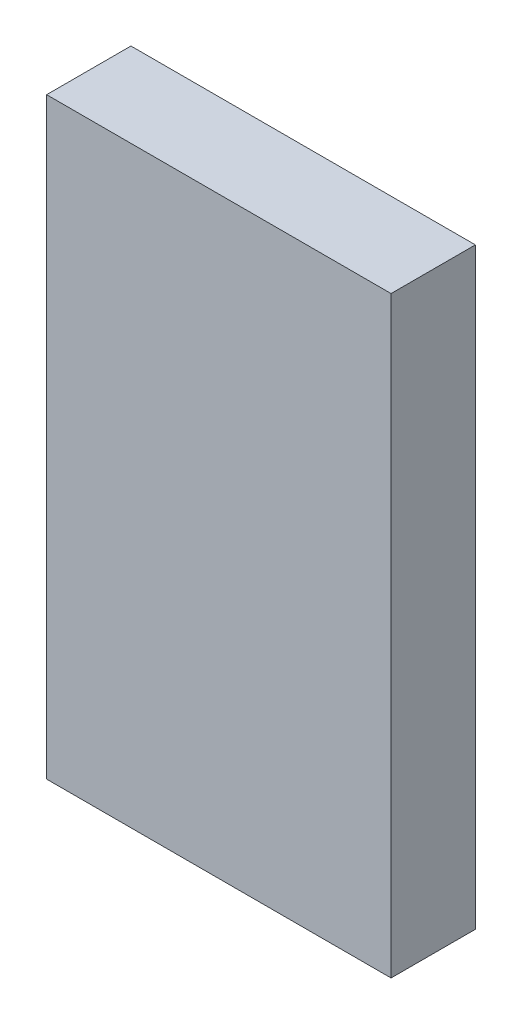
ISO-10303-21;
HEADER;
FILE_DESCRIPTION(('STEP AP214'),'2;1');
FILE_NAME('part.step','',(''),(''),'','','');
FILE_SCHEMA(('AUTOMOTIVE_DESIGN { 1 0 10303 214 1 1 1 1 }'));
ENDSEC;
DATA;
#1=APPLICATION_CONTEXT('core data for automotive mechanical design processes');
#2=APPLICATION_PROTOCOL_DEFINITION('international standard','automotive_design',2000,#1);
#3=PRODUCT_CONTEXT('',#1,'mechanical');
#4=PRODUCT('Part','Part','',(#3));
#5=PRODUCT_RELATED_PRODUCT_CATEGORY('part','',(#4));
#6=PRODUCT_DEFINITION_FORMATION('','',#4);
#7=PRODUCT_DEFINITION_CONTEXT('part definition',#1,'design');
#8=PRODUCT_DEFINITION('design','',#6,#7);
#9=PRODUCT_DEFINITION_SHAPE('','',#8);
#10=(LENGTH_UNIT() NAMED_UNIT(*) SI_UNIT(.MILLI.,.METRE.));
#11=(NAMED_UNIT(*) PLANE_ANGLE_UNIT() SI_UNIT($,.RADIAN.));
#12=(NAMED_UNIT(*) SI_UNIT($,.STERADIAN.) SOLID_ANGLE_UNIT());
#13=UNCERTAINTY_MEASURE_WITH_UNIT(LENGTH_MEASURE(1.E-05),#10,'distance_accuracy_value','');
#14=(GEOMETRIC_REPRESENTATION_CONTEXT(3) GLOBAL_UNCERTAINTY_ASSIGNED_CONTEXT((#13)) GLOBAL_UNIT_ASSIGNED_CONTEXT((#10,
#11,#12)) REPRESENTATION_CONTEXT('',''));
#15=CARTESIAN_POINT('',(0.,0.,0.));
#16=DIRECTION('',(0.,0.,1.));
#17=DIRECTION('',(1.,0.,0.));
#18=AXIS2_PLACEMENT_3D('',#15,#16,#17);
#19=CARTESIAN_POINT('',(40.85,-70.3,10.));
#20=DIRECTION('',(-1.,0.,0.));
#21=DIRECTION('',(0.,0.,1.));
#22=AXIS2_PLACEMENT_3D('',#19,#20,#21);
#23=PLANE('',#22);
#24=DIRECTION('',(0.,1.,0.));
#25=VECTOR('',#24,1.);
#26=CARTESIAN_POINT('',(40.85,-70.3,-10.));
#27=LINE('',#26,#25);
#28=CARTESIAN_POINT('',(40.85,-70.3,-10.));
#29=VERTEX_POINT('',#28);
#30=CARTESIAN_POINT('',(40.85,70.3,-10.));
#31=VERTEX_POINT('',#30);
#32=EDGE_CURVE('E111',#29,#31,#27,.T.);
#33=ORIENTED_EDGE('',*,*,#32,.T.);
#34=DIRECTION('',(0.,0.,-1.));
#35=VECTOR('',#34,1.);
#36=CARTESIAN_POINT('',(40.85,70.3,10.));
#37=LINE('',#36,#35);
#38=CARTESIAN_POINT('',(40.85,70.3,10.));
#39=VERTEX_POINT('',#38);
#40=EDGE_CURVE('E11',#39,#31,#37,.T.);
#41=ORIENTED_EDGE('',*,*,#40,.F.);
#42=DIRECTION('',(0.,1.,0.));
#43=VECTOR('',#42,1.);
#44=CARTESIAN_POINT('',(40.85,-70.3,10.));
#45=LINE('',#44,#43);
#46=CARTESIAN_POINT('',(40.85,-70.3,10.));
#47=VERTEX_POINT('',#46);
#48=EDGE_CURVE('E95',#47,#39,#45,.T.);
#49=ORIENTED_EDGE('',*,*,#48,.F.);
#50=DIRECTION('',(0.,0.,-1.));
#51=VECTOR('',#50,1.);
#52=CARTESIAN_POINT('',(40.85,-70.3,10.));
#53=LINE('',#52,#51);
#54=EDGE_CURVE('E107',#47,#29,#53,.T.);
#55=ORIENTED_EDGE('',*,*,#54,.T.);
#56=EDGE_LOOP('',(#33,#41,#49,#55));
#57=FACE_BOUND('',#56,.T.);
#58=ADVANCED_FACE('F43',(#57),#23,.F.);
#59=CARTESIAN_POINT('',(-40.85,70.3,10.));
#60=DIRECTION('',(0.,-1.,0.));
#61=DIRECTION('',(0.,0.,-1.));
#62=AXIS2_PLACEMENT_3D('',#59,#60,#61);
#63=PLANE('',#62);
#64=DIRECTION('',(-1.,0.,0.));
#65=VECTOR('',#64,1.);
#66=CARTESIAN_POINT('',(-40.85,70.3,-10.));
#67=LINE('',#66,#65);
#68=CARTESIAN_POINT('',(-40.85,70.3,-10.));
#69=VERTEX_POINT('',#68);
#70=EDGE_CURVE('E100',#31,#69,#67,.T.);
#71=ORIENTED_EDGE('',*,*,#70,.T.);
#72=DIRECTION('',(0.,0.,-1.));
#73=VECTOR('',#72,1.);
#74=CARTESIAN_POINT('',(-40.85,70.3,10.));
#75=LINE('',#74,#73);
#76=CARTESIAN_POINT('',(-40.85,70.3,10.));
#77=VERTEX_POINT('',#76);
#78=EDGE_CURVE('E52',#77,#69,#75,.T.);
#79=ORIENTED_EDGE('',*,*,#78,.F.);
#80=DIRECTION('',(-1.,0.,0.));
#81=VECTOR('',#80,1.);
#82=CARTESIAN_POINT('',(-40.85,70.3,10.));
#83=LINE('',#82,#81);
#84=EDGE_CURVE('E90',#39,#77,#83,.T.);
#85=ORIENTED_EDGE('',*,*,#84,.F.);
#86=ORIENTED_EDGE('',*,*,#40,.T.);
#87=EDGE_LOOP('',(#71,#79,#85,#86));
#88=FACE_BOUND('',#87,.T.);
#89=ADVANCED_FACE('F99',(#88),#63,.F.);
#90=CARTESIAN_POINT('',(-40.85,-70.3,10.));
#91=DIRECTION('',(1.,0.,0.));
#92=DIRECTION('',(0.,0.,-1.));
#93=AXIS2_PLACEMENT_3D('',#90,#91,#92);
#94=PLANE('',#93);
#95=DIRECTION('',(0.,-1.,0.));
#96=VECTOR('',#95,1.);
#97=CARTESIAN_POINT('',(-40.85,-70.3,-10.));
#98=LINE('',#97,#96);
#99=CARTESIAN_POINT('',(-40.85,-70.3,-10.));
#100=VERTEX_POINT('',#99);
#101=EDGE_CURVE('E77',#69,#100,#98,.T.);
#102=ORIENTED_EDGE('',*,*,#101,.T.);
#103=DIRECTION('',(0.,0.,-1.));
#104=VECTOR('',#103,1.);
#105=CARTESIAN_POINT('',(-40.85,-70.3,10.));
#106=LINE('',#105,#104);
#107=CARTESIAN_POINT('',(-40.85,-70.3,10.));
#108=VERTEX_POINT('',#107);
#109=EDGE_CURVE('E102',#108,#100,#106,.T.);
#110=ORIENTED_EDGE('',*,*,#109,.F.);
#111=DIRECTION('',(0.,-1.,0.));
#112=VECTOR('',#111,1.);
#113=CARTESIAN_POINT('',(-40.85,-70.3,10.));
#114=LINE('',#113,#112);
#115=EDGE_CURVE('E93',#77,#108,#114,.T.);
#116=ORIENTED_EDGE('',*,*,#115,.F.);
#117=ORIENTED_EDGE('',*,*,#78,.T.);
#118=EDGE_LOOP('',(#102,#110,#116,#117));
#119=FACE_BOUND('',#118,.T.);
#120=ADVANCED_FACE('F103',(#119),#94,.F.);
#121=CARTESIAN_POINT('',(-40.85,-70.3,10.));
#122=DIRECTION('',(0.,1.,0.));
#123=DIRECTION('',(0.,0.,1.));
#124=AXIS2_PLACEMENT_3D('',#121,#122,#123);
#125=PLANE('',#124);
#126=DIRECTION('',(1.,0.,0.));
#127=VECTOR('',#126,1.);
#128=CARTESIAN_POINT('',(-40.85,-70.3,-10.));
#129=LINE('',#128,#127);
#130=EDGE_CURVE('E83',#100,#29,#129,.T.);
#131=ORIENTED_EDGE('',*,*,#130,.T.);
#132=ORIENTED_EDGE('',*,*,#54,.F.);
#133=DIRECTION('',(1.,0.,0.));
#134=VECTOR('',#133,1.);
#135=CARTESIAN_POINT('',(-40.85,-70.3,10.));
#136=LINE('',#135,#134);
#137=EDGE_CURVE('E60',#108,#47,#136,.T.);
#138=ORIENTED_EDGE('',*,*,#137,.F.);
#139=ORIENTED_EDGE('',*,*,#109,.T.);
#140=EDGE_LOOP('',(#131,#132,#138,#139));
#141=FACE_BOUND('',#140,.T.);
#142=ADVANCED_FACE('F124',(#141),#125,.F.);
#143=CARTESIAN_POINT('',(0.,0.,10.));
#144=DIRECTION('',(0.,0.,-1.));
#145=DIRECTION('',(-1.,0.,0.));
#146=AXIS2_PLACEMENT_3D('',#143,#144,#145);
#147=PLANE('',#146);
#148=ORIENTED_EDGE('',*,*,#48,.T.);
#149=ORIENTED_EDGE('',*,*,#84,.T.);
#150=ORIENTED_EDGE('',*,*,#115,.T.);
#151=ORIENTED_EDGE('',*,*,#137,.T.);
#152=EDGE_LOOP('',(#148,#149,#150,#151));
#153=FACE_BOUND('',#152,.T.);
#154=ADVANCED_FACE('F91',(#153),#147,.F.);
#155=CARTESIAN_POINT('',(0.,0.,-10.));
#156=DIRECTION('',(0.,0.,-1.));
#157=DIRECTION('',(-1.,0.,0.));
#158=AXIS2_PLACEMENT_3D('',#155,#156,#157);
#159=PLANE('',#158);
#160=ORIENTED_EDGE('',*,*,#32,.F.);
#161=ORIENTED_EDGE('',*,*,#130,.F.);
#162=ORIENTED_EDGE('',*,*,#101,.F.);
#163=ORIENTED_EDGE('',*,*,#70,.F.);
#164=EDGE_LOOP('',(#160,#161,#162,#163));
#165=FACE_BOUND('',#164,.T.);
#166=ADVANCED_FACE('F127',(#165),#159,.T.);
#167=CLOSED_SHELL('',(#58,#89,#120,#142,#154,#166));
#168=MANIFOLD_SOLID_BREP('B2',#167);
#169=ADVANCED_BREP_SHAPE_REPRESENTATION('',(#18,#168),#14);
#170=SHAPE_DEFINITION_REPRESENTATION(#9,#169);
ENDSEC;
END-ISO-10303-21;
